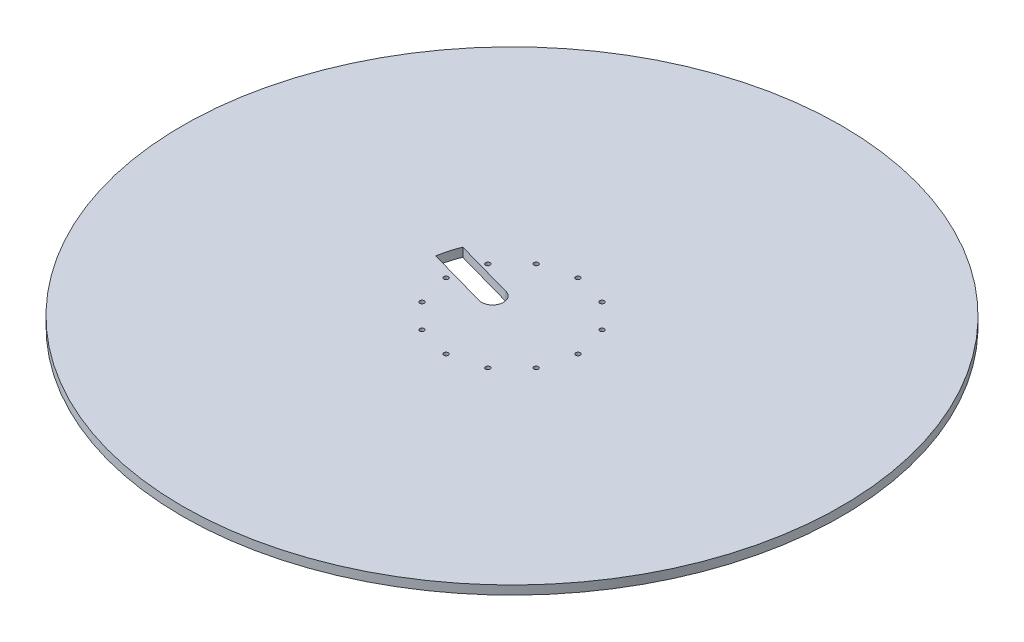
ISO-10303-21;
HEADER;
FILE_DESCRIPTION(('STEP AP214'),'2;1');
FILE_NAME('part.step','',(''),(''),'','','');
FILE_SCHEMA(('AUTOMOTIVE_DESIGN { 1 0 10303 214 1 1 1 1 }'));
ENDSEC;
DATA;
#1=APPLICATION_CONTEXT('core data for automotive mechanical design processes');
#2=APPLICATION_PROTOCOL_DEFINITION('international standard','automotive_design',2000,#1);
#3=PRODUCT_CONTEXT('',#1,'mechanical');
#4=PRODUCT('Part','Part','',(#3));
#5=PRODUCT_RELATED_PRODUCT_CATEGORY('part','',(#4));
#6=PRODUCT_DEFINITION_FORMATION('','',#4);
#7=PRODUCT_DEFINITION_CONTEXT('part definition',#1,'design');
#8=PRODUCT_DEFINITION('design','',#6,#7);
#9=PRODUCT_DEFINITION_SHAPE('','',#8);
#10=(LENGTH_UNIT() NAMED_UNIT(*) SI_UNIT(.MILLI.,.METRE.));
#11=(NAMED_UNIT(*) PLANE_ANGLE_UNIT() SI_UNIT($,.RADIAN.));
#12=(NAMED_UNIT(*) SI_UNIT($,.STERADIAN.) SOLID_ANGLE_UNIT());
#13=UNCERTAINTY_MEASURE_WITH_UNIT(LENGTH_MEASURE(1.E-05),#10,'distance_accuracy_value','');
#14=(GEOMETRIC_REPRESENTATION_CONTEXT(3) GLOBAL_UNCERTAINTY_ASSIGNED_CONTEXT((#13)) GLOBAL_UNIT_ASSIGNED_CONTEXT((#10,
#11,#12)) REPRESENTATION_CONTEXT('',''));
#15=CARTESIAN_POINT('',(0.,0.,0.));
#16=DIRECTION('',(0.,0.,1.));
#17=DIRECTION('',(1.,0.,0.));
#18=AXIS2_PLACEMENT_3D('',#15,#16,#17);
#19=CARTESIAN_POINT('',(0.,8.,0.));
#20=DIRECTION('',(0.,1.,0.));
#21=DIRECTION('',(0.,0.,1.));
#22=AXIS2_PLACEMENT_3D('',#19,#20,#21);
#23=PLANE('',#22);
#24=CARTESIAN_POINT('',(-51.961524227066,8.,-30.0000000000006));
#25=DIRECTION('',(0.,1.,0.));
#26=DIRECTION('',(0.,0.,1.));
#27=AXIS2_PLACEMENT_3D('',#24,#25,#26);
#28=CIRCLE('',#27,2.05);
#29=CARTESIAN_POINT('',(-51.961524227066,8.,-27.9500000000006));
#30=VERTEX_POINT('',#29);
#31=EDGE_CURVE('E118',#30,#30,#28,.T.);
#32=ORIENTED_EDGE('',*,*,#31,.F.);
#33=EDGE_LOOP('',(#32));
#34=FACE_BOUND('',#33,.T.);
#35=CARTESIAN_POINT('',(-51.9615242270666,8.,29.9999999999995));
#36=DIRECTION('',(0.,1.,0.));
#37=DIRECTION('',(0.,0.,1.));
#38=AXIS2_PLACEMENT_3D('',#35,#36,#37);
#39=CIRCLE('',#38,2.04999999999999);
#40=CARTESIAN_POINT('',(-51.9615242270666,8.,32.0499999999995));
#41=VERTEX_POINT('',#40);
#42=EDGE_CURVE('E130',#41,#41,#39,.T.);
#43=ORIENTED_EDGE('',*,*,#42,.F.);
#44=EDGE_LOOP('',(#43));
#45=FACE_BOUND('',#44,.T.);
#46=CARTESIAN_POINT('',(-4.18977760661176E-13,8.,60.));
#47=DIRECTION('',(0.,1.,0.));
#48=DIRECTION('',(0.,0.,1.));
#49=AXIS2_PLACEMENT_3D('',#46,#47,#48);
#50=CIRCLE('',#49,2.05);
#51=CARTESIAN_POINT('',(-4.18977760661176E-13,8.,62.05));
#52=VERTEX_POINT('',#51);
#53=EDGE_CURVE('E142',#52,#52,#50,.T.);
#54=ORIENTED_EDGE('',*,*,#53,.F.);
#55=EDGE_LOOP('',(#54));
#56=FACE_BOUND('',#55,.T.);
#57=CARTESIAN_POINT('',(51.9615242270662,8.,30.0000000000002));
#58=DIRECTION('',(0.,1.,0.));
#59=DIRECTION('',(0.,0.,1.));
#60=AXIS2_PLACEMENT_3D('',#57,#58,#59);
#61=CIRCLE('',#60,2.05);
#62=CARTESIAN_POINT('',(51.9615242270662,8.,32.0500000000002));
#63=VERTEX_POINT('',#62);
#64=EDGE_CURVE('E154',#63,#63,#61,.T.);
#65=ORIENTED_EDGE('',*,*,#64,.F.);
#66=EDGE_LOOP('',(#65));
#67=FACE_BOUND('',#66,.T.);
#68=CARTESIAN_POINT('',(51.9615242270664,8.,-29.9999999999999));
#69=DIRECTION('',(0.,1.,0.));
#70=DIRECTION('',(0.,0.,1.));
#71=AXIS2_PLACEMENT_3D('',#68,#69,#70);
#72=CIRCLE('',#71,2.04999999999999);
#73=CARTESIAN_POINT('',(51.9615242270664,8.,-27.9499999999999));
#74=VERTEX_POINT('',#73);
#75=EDGE_CURVE('E166',#74,#74,#72,.T.);
#76=ORIENTED_EDGE('',*,*,#75,.F.);
#77=EDGE_LOOP('',(#76));
#78=FACE_BOUND('',#77,.T.);
#79=CARTESIAN_POINT('',(0.,8.,-60.));
#80=DIRECTION('',(0.,1.,0.));
#81=DIRECTION('',(0.,0.,1.));
#82=AXIS2_PLACEMENT_3D('',#79,#80,#81);
#83=CIRCLE('',#82,2.05);
#84=CARTESIAN_POINT('',(0.,8.,-57.95));
#85=VERTEX_POINT('',#84);
#86=EDGE_CURVE('E178',#85,#85,#83,.T.);
#87=ORIENTED_EDGE('',*,*,#86,.F.);
#88=EDGE_LOOP('',(#87));
#89=FACE_BOUND('',#88,.T.);
#90=CARTESIAN_POINT('',(0.,8.,0.));
#91=DIRECTION('',(0.,1.,0.));
#92=DIRECTION('',(0.,0.,1.));
#93=AXIS2_PLACEMENT_3D('',#90,#91,#92);
#94=CIRCLE('',#93,300.);
#95=CARTESIAN_POINT('',(0.,8.,300.));
#96=VERTEX_POINT('',#95);
#97=EDGE_CURVE('E184',#96,#96,#94,.T.);
#98=ORIENTED_EDGE('',*,*,#97,.T.);
#99=EDGE_LOOP('',(#98));
#100=FACE_BOUND('',#99,.T.);
#101=CARTESIAN_POINT('',(30.0000000000001,8.,-51.9615242270663));
#102=DIRECTION('',(0.,1.,0.));
#103=DIRECTION('',(0.,0.,1.));
#104=AXIS2_PLACEMENT_3D('',#101,#102,#103);
#105=CIRCLE('',#104,2.05);
#106=CARTESIAN_POINT('',(30.0000000000001,8.,-49.9115242270663));
#107=VERTEX_POINT('',#106);
#108=EDGE_CURVE('E172',#107,#107,#105,.T.);
#109=ORIENTED_EDGE('',*,*,#108,.F.);
#110=EDGE_LOOP('',(#109));
#111=FACE_BOUND('',#110,.T.);
#112=CARTESIAN_POINT('',(60.,8.,2.09488880330588E-13));
#113=DIRECTION('',(0.,1.,0.));
#114=DIRECTION('',(0.,0.,1.));
#115=AXIS2_PLACEMENT_3D('',#112,#113,#114);
#116=CIRCLE('',#115,2.04999999999999);
#117=CARTESIAN_POINT('',(60.,8.,2.0500000000002));
#118=VERTEX_POINT('',#117);
#119=EDGE_CURVE('E160',#118,#118,#116,.T.);
#120=ORIENTED_EDGE('',*,*,#119,.F.);
#121=EDGE_LOOP('',(#120));
#122=FACE_BOUND('',#121,.T.);
#123=CARTESIAN_POINT('',(29.9999999999997,8.,51.9615242270665));
#124=DIRECTION('',(0.,1.,0.));
#125=DIRECTION('',(0.,0.,1.));
#126=AXIS2_PLACEMENT_3D('',#123,#124,#125);
#127=CIRCLE('',#126,2.05);
#128=CARTESIAN_POINT('',(29.9999999999997,8.,54.0115242270665));
#129=VERTEX_POINT('',#128);
#130=EDGE_CURVE('E148',#129,#129,#127,.T.);
#131=ORIENTED_EDGE('',*,*,#130,.F.);
#132=EDGE_LOOP('',(#131));
#133=FACE_BOUND('',#132,.T.);
#134=CARTESIAN_POINT('',(-30.0000000000004,8.,51.9615242270661));
#135=DIRECTION('',(0.,1.,0.));
#136=DIRECTION('',(0.,0.,1.));
#137=AXIS2_PLACEMENT_3D('',#134,#135,#136);
#138=CIRCLE('',#137,2.05);
#139=CARTESIAN_POINT('',(-30.0000000000004,8.,54.0115242270661));
#140=VERTEX_POINT('',#139);
#141=EDGE_CURVE('E136',#140,#140,#138,.T.);
#142=ORIENTED_EDGE('',*,*,#141,.F.);
#143=EDGE_LOOP('',(#142));
#144=FACE_BOUND('',#143,.T.);
#145=CARTESIAN_POINT('',(-60.,8.,-6.28466640991764E-13));
#146=DIRECTION('',(0.,1.,0.));
#147=DIRECTION('',(0.,0.,1.));
#148=AXIS2_PLACEMENT_3D('',#145,#146,#147);
#149=CIRCLE('',#148,2.05);
#150=CARTESIAN_POINT('',(-60.,8.,2.04999999999937));
#151=VERTEX_POINT('',#150);
#152=EDGE_CURVE('E124',#151,#151,#149,.T.);
#153=ORIENTED_EDGE('',*,*,#152,.F.);
#154=EDGE_LOOP('',(#153));
#155=FACE_BOUND('',#154,.T.);
#156=CARTESIAN_POINT('',(-29.9999999999993,8.,-51.9615242270667));
#157=DIRECTION('',(0.,1.,0.));
#158=DIRECTION('',(0.,0.,1.));
#159=AXIS2_PLACEMENT_3D('',#156,#157,#158);
#160=CIRCLE('',#159,2.05);
#161=CARTESIAN_POINT('',(-29.9999999999993,8.,-49.9115242270667));
#162=VERTEX_POINT('',#161);
#163=EDGE_CURVE('E112',#162,#162,#160,.T.);
#164=ORIENTED_EDGE('',*,*,#163,.F.);
#165=EDGE_LOOP('',(#164));
#166=FACE_BOUND('',#165,.T.);
#167=DIRECTION('',(-0.962954412182271,0.,-0.26966423577979));
#168=VECTOR('',#167,1.);
#169=CARTESIAN_POINT('',(2.6966423577979,8.,-9.62954412182271));
#170=LINE('',#169,#168);
#171=CARTESIAN_POINT('',(-21.85869515285,8.,-16.5059821342074));
#172=VERTEX_POINT('',#171);
#173=CARTESIAN_POINT('',(-76.6463602725632,8.,-31.8486335180716));
#174=VERTEX_POINT('',#173);
#175=EDGE_CURVE('E102',#172,#174,#170,.T.);
#176=ORIENTED_EDGE('',*,*,#175,.F.);
#177=CARTESIAN_POINT('',(-24.5553375106479,8.,-6.87643801238465));
#178=DIRECTION('',(0.,1.,0.));
#179=DIRECTION('',(0.,0.,1.));
#180=AXIS2_PLACEMENT_3D('',#177,#178,#179);
#181=CIRCLE('',#180,10.);
#182=CARTESIAN_POINT('',(-14.9257933888252,8.,-4.17979565458674));
#183=VERTEX_POINT('',#182);
#184=EDGE_CURVE('E41',#172,#183,#181,.F.);
#185=ORIENTED_EDGE('',*,*,#184,.T.);
#186=CARTESIAN_POINT('',(-24.5553375106479,8.,-6.87643801238464));
#187=DIRECTION('',(0.,1.,0.));
#188=DIRECTION('',(0.,0.,1.));
#189=AXIS2_PLACEMENT_3D('',#186,#187,#188);
#190=CIRCLE('',#189,10.);
#191=CARTESIAN_POINT('',(-27.2519798684458,8.,2.75310610943807));
#192=VERTEX_POINT('',#191);
#193=EDGE_CURVE('E192',#183,#192,#190,.F.);
#194=ORIENTED_EDGE('',*,*,#193,.T.);
#195=DIRECTION('',(-0.96295441218227,0.,-0.26966423577979));
#196=VECTOR('',#195,1.);
#197=CARTESIAN_POINT('',(-2.6966423577979,8.,9.62954412182271));
#198=LINE('',#197,#196);
#199=CARTESIAN_POINT('',(-82.0396449881591,8.,-12.5895452744262));
#200=VERTEX_POINT('',#199);
#201=EDGE_CURVE('E104',#192,#200,#198,.T.);
#202=ORIENTED_EDGE('',*,*,#201,.T.);
#203=CARTESIAN_POINT('',(0.,8.,0.));
#204=DIRECTION('',(0.,1.,0.));
#205=DIRECTION('',(0.,0.,1.));
#206=AXIS2_PLACEMENT_3D('',#203,#204,#205);
#207=CIRCLE('',#206,83.);
#208=EDGE_CURVE('E97',#200,#174,#207,.F.);
#209=ORIENTED_EDGE('',*,*,#208,.T.);
#210=EDGE_LOOP('',(#176,#185,#194,#202,#209));
#211=FACE_BOUND('',#210,.T.);
#212=ADVANCED_FACE('F32',(#34,#45,#56,#67,#78,#89,#100,#111,#122,#133,#144,#155,#166,#211),#23,.T.);
#213=CARTESIAN_POINT('',(0.,0.,0.));
#214=DIRECTION('',(0.,1.,0.));
#215=DIRECTION('',(0.,0.,1.));
#216=AXIS2_PLACEMENT_3D('',#213,#214,#215);
#217=PLANE('',#216);
#218=CARTESIAN_POINT('',(-29.9999999999993,0.,-51.9615242270667));
#219=DIRECTION('',(0.,1.,0.));
#220=DIRECTION('',(0.,0.,1.));
#221=AXIS2_PLACEMENT_3D('',#218,#219,#220);
#222=CIRCLE('',#221,2.05);
#223=CARTESIAN_POINT('',(-29.9999999999993,0.,-49.9115242270667));
#224=VERTEX_POINT('',#223);
#225=EDGE_CURVE('E110',#224,#224,#222,.T.);
#226=ORIENTED_EDGE('',*,*,#225,.T.);
#227=EDGE_LOOP('',(#226));
#228=FACE_BOUND('',#227,.T.);
#229=CARTESIAN_POINT('',(-51.961524227066,0.,-30.0000000000006));
#230=DIRECTION('',(0.,1.,0.));
#231=DIRECTION('',(0.,0.,1.));
#232=AXIS2_PLACEMENT_3D('',#229,#230,#231);
#233=CIRCLE('',#232,2.05);
#234=CARTESIAN_POINT('',(-51.961524227066,0.,-27.9500000000006));
#235=VERTEX_POINT('',#234);
#236=EDGE_CURVE('E115',#235,#235,#233,.T.);
#237=ORIENTED_EDGE('',*,*,#236,.T.);
#238=EDGE_LOOP('',(#237));
#239=FACE_BOUND('',#238,.T.);
#240=CARTESIAN_POINT('',(-60.,0.,-6.28466640991764E-13));
#241=DIRECTION('',(0.,1.,0.));
#242=DIRECTION('',(0.,0.,1.));
#243=AXIS2_PLACEMENT_3D('',#240,#241,#242);
#244=CIRCLE('',#243,2.05);
#245=CARTESIAN_POINT('',(-60.,0.,2.04999999999937));
#246=VERTEX_POINT('',#245);
#247=EDGE_CURVE('E121',#246,#246,#244,.T.);
#248=ORIENTED_EDGE('',*,*,#247,.T.);
#249=EDGE_LOOP('',(#248));
#250=FACE_BOUND('',#249,.T.);
#251=CARTESIAN_POINT('',(-51.9615242270666,0.,29.9999999999995));
#252=DIRECTION('',(0.,1.,0.));
#253=DIRECTION('',(0.,0.,1.));
#254=AXIS2_PLACEMENT_3D('',#251,#252,#253);
#255=CIRCLE('',#254,2.04999999999999);
#256=CARTESIAN_POINT('',(-51.9615242270666,0.,32.0499999999995));
#257=VERTEX_POINT('',#256);
#258=EDGE_CURVE('E127',#257,#257,#255,.T.);
#259=ORIENTED_EDGE('',*,*,#258,.T.);
#260=EDGE_LOOP('',(#259));
#261=FACE_BOUND('',#260,.T.);
#262=CARTESIAN_POINT('',(-30.0000000000004,0.,51.9615242270661));
#263=DIRECTION('',(0.,1.,0.));
#264=DIRECTION('',(0.,0.,1.));
#265=AXIS2_PLACEMENT_3D('',#262,#263,#264);
#266=CIRCLE('',#265,2.05);
#267=CARTESIAN_POINT('',(-30.0000000000004,0.,54.0115242270661));
#268=VERTEX_POINT('',#267);
#269=EDGE_CURVE('E133',#268,#268,#266,.T.);
#270=ORIENTED_EDGE('',*,*,#269,.T.);
#271=EDGE_LOOP('',(#270));
#272=FACE_BOUND('',#271,.T.);
#273=CARTESIAN_POINT('',(-4.18977760661176E-13,0.,60.));
#274=DIRECTION('',(0.,1.,0.));
#275=DIRECTION('',(0.,0.,1.));
#276=AXIS2_PLACEMENT_3D('',#273,#274,#275);
#277=CIRCLE('',#276,2.05);
#278=CARTESIAN_POINT('',(-4.18977760661176E-13,0.,62.05));
#279=VERTEX_POINT('',#278);
#280=EDGE_CURVE('E139',#279,#279,#277,.T.);
#281=ORIENTED_EDGE('',*,*,#280,.T.);
#282=EDGE_LOOP('',(#281));
#283=FACE_BOUND('',#282,.T.);
#284=CARTESIAN_POINT('',(29.9999999999997,0.,51.9615242270665));
#285=DIRECTION('',(0.,1.,0.));
#286=DIRECTION('',(0.,0.,1.));
#287=AXIS2_PLACEMENT_3D('',#284,#285,#286);
#288=CIRCLE('',#287,2.05);
#289=CARTESIAN_POINT('',(29.9999999999997,0.,54.0115242270665));
#290=VERTEX_POINT('',#289);
#291=EDGE_CURVE('E145',#290,#290,#288,.T.);
#292=ORIENTED_EDGE('',*,*,#291,.T.);
#293=EDGE_LOOP('',(#292));
#294=FACE_BOUND('',#293,.T.);
#295=CARTESIAN_POINT('',(51.9615242270662,0.,30.0000000000002));
#296=DIRECTION('',(0.,1.,0.));
#297=DIRECTION('',(0.,0.,1.));
#298=AXIS2_PLACEMENT_3D('',#295,#296,#297);
#299=CIRCLE('',#298,2.05);
#300=CARTESIAN_POINT('',(51.9615242270662,0.,32.0500000000002));
#301=VERTEX_POINT('',#300);
#302=EDGE_CURVE('E151',#301,#301,#299,.T.);
#303=ORIENTED_EDGE('',*,*,#302,.T.);
#304=EDGE_LOOP('',(#303));
#305=FACE_BOUND('',#304,.T.);
#306=CARTESIAN_POINT('',(60.,0.,2.09488880330588E-13));
#307=DIRECTION('',(0.,1.,0.));
#308=DIRECTION('',(0.,0.,1.));
#309=AXIS2_PLACEMENT_3D('',#306,#307,#308);
#310=CIRCLE('',#309,2.04999999999999);
#311=CARTESIAN_POINT('',(60.,0.,2.0500000000002));
#312=VERTEX_POINT('',#311);
#313=EDGE_CURVE('E157',#312,#312,#310,.T.);
#314=ORIENTED_EDGE('',*,*,#313,.T.);
#315=EDGE_LOOP('',(#314));
#316=FACE_BOUND('',#315,.T.);
#317=CARTESIAN_POINT('',(51.9615242270664,0.,-29.9999999999999));
#318=DIRECTION('',(0.,1.,0.));
#319=DIRECTION('',(0.,0.,1.));
#320=AXIS2_PLACEMENT_3D('',#317,#318,#319);
#321=CIRCLE('',#320,2.04999999999999);
#322=CARTESIAN_POINT('',(51.9615242270664,0.,-27.9499999999999));
#323=VERTEX_POINT('',#322);
#324=EDGE_CURVE('E163',#323,#323,#321,.T.);
#325=ORIENTED_EDGE('',*,*,#324,.T.);
#326=EDGE_LOOP('',(#325));
#327=FACE_BOUND('',#326,.T.);
#328=CARTESIAN_POINT('',(30.0000000000001,0.,-51.9615242270663));
#329=DIRECTION('',(0.,1.,0.));
#330=DIRECTION('',(0.,0.,1.));
#331=AXIS2_PLACEMENT_3D('',#328,#329,#330);
#332=CIRCLE('',#331,2.05);
#333=CARTESIAN_POINT('',(30.0000000000001,0.,-49.9115242270663));
#334=VERTEX_POINT('',#333);
#335=EDGE_CURVE('E169',#334,#334,#332,.T.);
#336=ORIENTED_EDGE('',*,*,#335,.T.);
#337=EDGE_LOOP('',(#336));
#338=FACE_BOUND('',#337,.T.);
#339=CARTESIAN_POINT('',(0.,0.,-60.));
#340=DIRECTION('',(0.,1.,0.));
#341=DIRECTION('',(0.,0.,1.));
#342=AXIS2_PLACEMENT_3D('',#339,#340,#341);
#343=CIRCLE('',#342,2.05);
#344=CARTESIAN_POINT('',(0.,0.,-57.95));
#345=VERTEX_POINT('',#344);
#346=EDGE_CURVE('E175',#345,#345,#343,.T.);
#347=ORIENTED_EDGE('',*,*,#346,.T.);
#348=EDGE_LOOP('',(#347));
#349=FACE_BOUND('',#348,.T.);
#350=CARTESIAN_POINT('',(0.,0.,0.));
#351=DIRECTION('',(0.,1.,0.));
#352=DIRECTION('',(0.,0.,1.));
#353=AXIS2_PLACEMENT_3D('',#350,#351,#352);
#354=CIRCLE('',#353,300.);
#355=CARTESIAN_POINT('',(0.,0.,300.));
#356=VERTEX_POINT('',#355);
#357=EDGE_CURVE('E181',#356,#356,#354,.T.);
#358=ORIENTED_EDGE('',*,*,#357,.F.);
#359=EDGE_LOOP('',(#358));
#360=FACE_BOUND('',#359,.T.);
#361=CARTESIAN_POINT('',(0.,0.,0.));
#362=DIRECTION('',(0.,1.,0.));
#363=DIRECTION('',(0.,0.,1.));
#364=AXIS2_PLACEMENT_3D('',#361,#362,#363);
#365=CIRCLE('',#364,83.);
#366=CARTESIAN_POINT('',(-82.0396449881591,0.,-12.5895452744262));
#367=VERTEX_POINT('',#366);
#368=CARTESIAN_POINT('',(-76.6463602725632,0.,-31.8486335180716));
#369=VERTEX_POINT('',#368);
#370=EDGE_CURVE('E88',#367,#369,#365,.F.);
#371=ORIENTED_EDGE('',*,*,#370,.F.);
#372=DIRECTION('',(-0.96295441218227,0.,-0.26966423577979));
#373=VECTOR('',#372,1.);
#374=CARTESIAN_POINT('',(-2.6966423577979,0.,9.62954412182271));
#375=LINE('',#374,#373);
#376=CARTESIAN_POINT('',(-27.2519798684458,0.,2.75310610943807));
#377=VERTEX_POINT('',#376);
#378=EDGE_CURVE('E79',#377,#367,#375,.T.);
#379=ORIENTED_EDGE('',*,*,#378,.F.);
#380=CARTESIAN_POINT('',(-24.5553375106479,0.,-6.87643801238464));
#381=DIRECTION('',(0.,1.,0.));
#382=DIRECTION('',(0.,0.,1.));
#383=AXIS2_PLACEMENT_3D('',#380,#381,#382);
#384=CIRCLE('',#383,10.);
#385=CARTESIAN_POINT('',(-14.9257933888252,0.,-4.17979565458674));
#386=VERTEX_POINT('',#385);
#387=EDGE_CURVE('E47',#377,#386,#384,.T.);
#388=ORIENTED_EDGE('',*,*,#387,.T.);
#389=CARTESIAN_POINT('',(-24.5553375106479,0.,-6.87643801238465));
#390=DIRECTION('',(0.,1.,0.));
#391=DIRECTION('',(0.,0.,1.));
#392=AXIS2_PLACEMENT_3D('',#389,#390,#391);
#393=CIRCLE('',#392,10.);
#394=CARTESIAN_POINT('',(-21.85869515285,0.,-16.5059821342074));
#395=VERTEX_POINT('',#394);
#396=EDGE_CURVE('E11',#386,#395,#393,.T.);
#397=ORIENTED_EDGE('',*,*,#396,.T.);
#398=DIRECTION('',(-0.962954412182271,0.,-0.26966423577979));
#399=VECTOR('',#398,1.);
#400=CARTESIAN_POINT('',(2.6966423577979,0.,-9.62954412182271));
#401=LINE('',#400,#399);
#402=EDGE_CURVE('E87',#395,#369,#401,.T.);
#403=ORIENTED_EDGE('',*,*,#402,.T.);
#404=EDGE_LOOP('',(#371,#379,#388,#397,#403));
#405=FACE_BOUND('',#404,.T.);
#406=ADVANCED_FACE('F100',(#228,#239,#250,#261,#272,#283,#294,#305,#316,#327,#338,#349,#360,
#405),#217,.F.);
#407=CARTESIAN_POINT('',(0.,8.,0.));
#408=DIRECTION('',(0.,-1.,0.));
#409=DIRECTION('',(0.,0.,-1.));
#410=AXIS2_PLACEMENT_3D('',#407,#408,#409);
#411=CYLINDRICAL_SURFACE('',#410,300.);
#412=ORIENTED_EDGE('',*,*,#97,.F.);
#413=EDGE_LOOP('',(#412));
#414=FACE_BOUND('',#413,.T.);
#415=ORIENTED_EDGE('',*,*,#357,.T.);
#416=EDGE_LOOP('',(#415));
#417=FACE_BOUND('',#416,.T.);
#418=ADVANCED_FACE('F218',(#414,#417),#411,.T.);
#419=CARTESIAN_POINT('',(0.,8.,-60.));
#420=DIRECTION('',(0.,-1.,0.));
#421=DIRECTION('',(0.,0.,-1.));
#422=AXIS2_PLACEMENT_3D('',#419,#420,#421);
#423=CYLINDRICAL_SURFACE('',#422,2.05);
#424=ORIENTED_EDGE('',*,*,#86,.T.);
#425=EDGE_LOOP('',(#424));
#426=FACE_BOUND('',#425,.T.);
#427=ORIENTED_EDGE('',*,*,#346,.F.);
#428=EDGE_LOOP('',(#427));
#429=FACE_BOUND('',#428,.T.);
#430=ADVANCED_FACE('F224',(#426,#429),#423,.F.);
#431=CARTESIAN_POINT('',(30.0000000000001,8.,-51.9615242270663));
#432=DIRECTION('',(0.,-1.,0.));
#433=DIRECTION('',(0.,0.,-1.));
#434=AXIS2_PLACEMENT_3D('',#431,#432,#433);
#435=CYLINDRICAL_SURFACE('',#434,2.05);
#436=ORIENTED_EDGE('',*,*,#108,.T.);
#437=EDGE_LOOP('',(#436));
#438=FACE_BOUND('',#437,.T.);
#439=ORIENTED_EDGE('',*,*,#335,.F.);
#440=EDGE_LOOP('',(#439));
#441=FACE_BOUND('',#440,.T.);
#442=ADVANCED_FACE('F358',(#438,#441),#435,.F.);
#443=CARTESIAN_POINT('',(51.9615242270664,8.,-29.9999999999999));
#444=DIRECTION('',(0.,-1.,0.));
#445=DIRECTION('',(0.,0.,-1.));
#446=AXIS2_PLACEMENT_3D('',#443,#444,#445);
#447=CYLINDRICAL_SURFACE('',#446,2.04999999999999);
#448=ORIENTED_EDGE('',*,*,#75,.T.);
#449=EDGE_LOOP('',(#448));
#450=FACE_BOUND('',#449,.T.);
#451=ORIENTED_EDGE('',*,*,#324,.F.);
#452=EDGE_LOOP('',(#451));
#453=FACE_BOUND('',#452,.T.);
#454=ADVANCED_FACE('F348',(#450,#453),#447,.F.);
#455=CARTESIAN_POINT('',(60.,8.,2.09488880330588E-13));
#456=DIRECTION('',(0.,-1.,0.));
#457=DIRECTION('',(0.,0.,-1.));
#458=AXIS2_PLACEMENT_3D('',#455,#456,#457);
#459=CYLINDRICAL_SURFACE('',#458,2.04999999999999);
#460=ORIENTED_EDGE('',*,*,#119,.T.);
#461=EDGE_LOOP('',(#460));
#462=FACE_BOUND('',#461,.T.);
#463=ORIENTED_EDGE('',*,*,#313,.F.);
#464=EDGE_LOOP('',(#463));
#465=FACE_BOUND('',#464,.T.);
#466=ADVANCED_FACE('F338',(#462,#465),#459,.F.);
#467=CARTESIAN_POINT('',(51.9615242270662,8.,30.0000000000002));
#468=DIRECTION('',(0.,-1.,0.));
#469=DIRECTION('',(0.,0.,-1.));
#470=AXIS2_PLACEMENT_3D('',#467,#468,#469);
#471=CYLINDRICAL_SURFACE('',#470,2.05);
#472=ORIENTED_EDGE('',*,*,#64,.T.);
#473=EDGE_LOOP('',(#472));
#474=FACE_BOUND('',#473,.T.);
#475=ORIENTED_EDGE('',*,*,#302,.F.);
#476=EDGE_LOOP('',(#475));
#477=FACE_BOUND('',#476,.T.);
#478=ADVANCED_FACE('F328',(#474,#477),#471,.F.);
#479=CARTESIAN_POINT('',(29.9999999999997,8.,51.9615242270665));
#480=DIRECTION('',(0.,-1.,0.));
#481=DIRECTION('',(0.,0.,-1.));
#482=AXIS2_PLACEMENT_3D('',#479,#480,#481);
#483=CYLINDRICAL_SURFACE('',#482,2.05);
#484=ORIENTED_EDGE('',*,*,#130,.T.);
#485=EDGE_LOOP('',(#484));
#486=FACE_BOUND('',#485,.T.);
#487=ORIENTED_EDGE('',*,*,#291,.F.);
#488=EDGE_LOOP('',(#487));
#489=FACE_BOUND('',#488,.T.);
#490=ADVANCED_FACE('F318',(#486,#489),#483,.F.);
#491=CARTESIAN_POINT('',(-4.18977760661176E-13,8.,60.));
#492=DIRECTION('',(0.,-1.,0.));
#493=DIRECTION('',(0.,0.,-1.));
#494=AXIS2_PLACEMENT_3D('',#491,#492,#493);
#495=CYLINDRICAL_SURFACE('',#494,2.05);
#496=ORIENTED_EDGE('',*,*,#53,.T.);
#497=EDGE_LOOP('',(#496));
#498=FACE_BOUND('',#497,.T.);
#499=ORIENTED_EDGE('',*,*,#280,.F.);
#500=EDGE_LOOP('',(#499));
#501=FACE_BOUND('',#500,.T.);
#502=ADVANCED_FACE('F308',(#498,#501),#495,.F.);
#503=CARTESIAN_POINT('',(-30.0000000000004,8.,51.9615242270661));
#504=DIRECTION('',(0.,-1.,0.));
#505=DIRECTION('',(0.,0.,-1.));
#506=AXIS2_PLACEMENT_3D('',#503,#504,#505);
#507=CYLINDRICAL_SURFACE('',#506,2.05);
#508=ORIENTED_EDGE('',*,*,#141,.T.);
#509=EDGE_LOOP('',(#508));
#510=FACE_BOUND('',#509,.T.);
#511=ORIENTED_EDGE('',*,*,#269,.F.);
#512=EDGE_LOOP('',(#511));
#513=FACE_BOUND('',#512,.T.);
#514=ADVANCED_FACE('F298',(#510,#513),#507,.F.);
#515=CARTESIAN_POINT('',(-51.9615242270666,8.,29.9999999999995));
#516=DIRECTION('',(0.,-1.,0.));
#517=DIRECTION('',(0.,0.,-1.));
#518=AXIS2_PLACEMENT_3D('',#515,#516,#517);
#519=CYLINDRICAL_SURFACE('',#518,2.04999999999999);
#520=ORIENTED_EDGE('',*,*,#42,.T.);
#521=EDGE_LOOP('',(#520));
#522=FACE_BOUND('',#521,.T.);
#523=ORIENTED_EDGE('',*,*,#258,.F.);
#524=EDGE_LOOP('',(#523));
#525=FACE_BOUND('',#524,.T.);
#526=ADVANCED_FACE('F288',(#522,#525),#519,.F.);
#527=CARTESIAN_POINT('',(-60.,8.,-6.28466640991764E-13));
#528=DIRECTION('',(0.,-1.,0.));
#529=DIRECTION('',(0.,0.,-1.));
#530=AXIS2_PLACEMENT_3D('',#527,#528,#529);
#531=CYLINDRICAL_SURFACE('',#530,2.05);
#532=ORIENTED_EDGE('',*,*,#152,.T.);
#533=EDGE_LOOP('',(#532));
#534=FACE_BOUND('',#533,.T.);
#535=ORIENTED_EDGE('',*,*,#247,.F.);
#536=EDGE_LOOP('',(#535));
#537=FACE_BOUND('',#536,.T.);
#538=ADVANCED_FACE('F278',(#534,#537),#531,.F.);
#539=CARTESIAN_POINT('',(-51.961524227066,8.,-30.0000000000006));
#540=DIRECTION('',(0.,-1.,0.));
#541=DIRECTION('',(0.,0.,-1.));
#542=AXIS2_PLACEMENT_3D('',#539,#540,#541);
#543=CYLINDRICAL_SURFACE('',#542,2.05);
#544=ORIENTED_EDGE('',*,*,#31,.T.);
#545=EDGE_LOOP('',(#544));
#546=FACE_BOUND('',#545,.T.);
#547=ORIENTED_EDGE('',*,*,#236,.F.);
#548=EDGE_LOOP('',(#547));
#549=FACE_BOUND('',#548,.T.);
#550=ADVANCED_FACE('F268',(#546,#549),#543,.F.);
#551=CARTESIAN_POINT('',(-29.9999999999993,8.,-51.9615242270667));
#552=DIRECTION('',(0.,-1.,0.));
#553=DIRECTION('',(0.,0.,-1.));
#554=AXIS2_PLACEMENT_3D('',#551,#552,#553);
#555=CYLINDRICAL_SURFACE('',#554,2.05);
#556=ORIENTED_EDGE('',*,*,#163,.T.);
#557=EDGE_LOOP('',(#556));
#558=FACE_BOUND('',#557,.T.);
#559=ORIENTED_EDGE('',*,*,#225,.F.);
#560=EDGE_LOOP('',(#559));
#561=FACE_BOUND('',#560,.T.);
#562=ADVANCED_FACE('F210',(#558,#561),#555,.F.);
#563=CARTESIAN_POINT('',(0.,0.,0.));
#564=DIRECTION('',(0.,1.,0.));
#565=DIRECTION('',(0.,0.,1.));
#566=AXIS2_PLACEMENT_3D('',#563,#564,#565);
#567=CYLINDRICAL_SURFACE('',#566,83.);
#568=ORIENTED_EDGE('',*,*,#208,.F.);
#569=DIRECTION('',(0.,1.,0.));
#570=VECTOR('',#569,1.);
#571=CARTESIAN_POINT('',(-82.0396449881591,0.,-12.5895452744262));
#572=LINE('',#571,#570);
#573=EDGE_CURVE('E83',#367,#200,#572,.T.);
#574=ORIENTED_EDGE('',*,*,#573,.F.);
#575=ORIENTED_EDGE('',*,*,#370,.T.);
#576=DIRECTION('',(0.,1.,0.));
#577=VECTOR('',#576,1.);
#578=CARTESIAN_POINT('',(-76.6463602725632,0.,-31.8486335180716));
#579=LINE('',#578,#577);
#580=EDGE_CURVE('E98',#369,#174,#579,.T.);
#581=ORIENTED_EDGE('',*,*,#580,.T.);
#582=EDGE_LOOP('',(#568,#574,#575,#581));
#583=FACE_BOUND('',#582,.T.);
#584=ADVANCED_FACE('F93',(#583),#567,.F.);
#585=CARTESIAN_POINT('',(2.6966423577979,0.,-9.62954412182271));
#586=DIRECTION('',(0.26966423577979,0.,-0.96295441218227));
#587=DIRECTION('',(-0.962954412182271,0.,-0.26966423577979));
#588=AXIS2_PLACEMENT_3D('',#585,#586,#587);
#589=PLANE('',#588);
#590=ORIENTED_EDGE('',*,*,#402,.F.);
#591=DIRECTION('',(0.,1.,0.));
#592=VECTOR('',#591,1.);
#593=CARTESIAN_POINT('',(-21.85869515285,8.,-16.5059821342074));
#594=LINE('',#593,#592);
#595=EDGE_CURVE('E190',#395,#172,#594,.T.);
#596=ORIENTED_EDGE('',*,*,#595,.T.);
#597=ORIENTED_EDGE('',*,*,#175,.T.);
#598=ORIENTED_EDGE('',*,*,#580,.F.);
#599=EDGE_LOOP('',(#590,#596,#597,#598));
#600=FACE_BOUND('',#599,.T.);
#601=ADVANCED_FACE('F202',(#600),#589,.F.);
#602=CARTESIAN_POINT('',(-2.6966423577979,0.,9.62954412182271));
#603=DIRECTION('',(0.26966423577979,0.,-0.96295441218227));
#604=DIRECTION('',(-0.96295441218227,0.,-0.26966423577979));
#605=AXIS2_PLACEMENT_3D('',#602,#603,#604);
#606=PLANE('',#605);
#607=ORIENTED_EDGE('',*,*,#201,.F.);
#608=DIRECTION('',(0.,1.,0.));
#609=VECTOR('',#608,1.);
#610=CARTESIAN_POINT('',(-27.2519798684458,0.,2.75310610943807));
#611=LINE('',#610,#609);
#612=EDGE_CURVE('E85',#192,#377,#611,.F.);
#613=ORIENTED_EDGE('',*,*,#612,.T.);
#614=ORIENTED_EDGE('',*,*,#378,.T.);
#615=ORIENTED_EDGE('',*,*,#573,.T.);
#616=EDGE_LOOP('',(#607,#613,#614,#615));
#617=FACE_BOUND('',#616,.T.);
#618=ADVANCED_FACE('F82',(#617),#606,.T.);
#619=CARTESIAN_POINT('',(-24.5553375106479,0.,-6.87643801238465));
#620=DIRECTION('',(0.,-1.,0.));
#621=DIRECTION('',(0.,0.,-1.));
#622=AXIS2_PLACEMENT_3D('',#619,#620,#621);
#623=CYLINDRICAL_SURFACE('',#622,10.);
#624=ORIENTED_EDGE('',*,*,#595,.F.);
#625=ORIENTED_EDGE('',*,*,#396,.F.);
#626=DIRECTION('',(0.,1.,0.));
#627=VECTOR('',#626,1.);
#628=CARTESIAN_POINT('',(-14.9257933888252,0.,-4.17979565458675));
#629=LINE('',#628,#627);
#630=EDGE_CURVE('E36',#183,#386,#629,.F.);
#631=ORIENTED_EDGE('',*,*,#630,.F.);
#632=ORIENTED_EDGE('',*,*,#184,.F.);
#633=EDGE_LOOP('',(#624,#625,#631,#632));
#634=FACE_BOUND('',#633,.T.);
#635=ADVANCED_FACE('F34',(#634),#623,.F.);
#636=CARTESIAN_POINT('',(-24.5553375106479,0.,-6.87643801238464));
#637=DIRECTION('',(0.,1.,0.));
#638=DIRECTION('',(0.,0.,1.));
#639=AXIS2_PLACEMENT_3D('',#636,#637,#638);
#640=CYLINDRICAL_SURFACE('',#639,10.);
#641=ORIENTED_EDGE('',*,*,#387,.F.);
#642=ORIENTED_EDGE('',*,*,#612,.F.);
#643=ORIENTED_EDGE('',*,*,#193,.F.);
#644=ORIENTED_EDGE('',*,*,#630,.T.);
#645=EDGE_LOOP('',(#641,#642,#643,#644));
#646=FACE_BOUND('',#645,.T.);
#647=ADVANCED_FACE('F198',(#646),#640,.F.);
#648=CLOSED_SHELL('',(#212,#406,#418,#430,#442,#454,#466,#478,#490,#502,#514,#526,#538,#550,
#562,#584,#601,#618,#635,#647));
#649=MANIFOLD_SOLID_BREP('B2',#648);
#650=ADVANCED_BREP_SHAPE_REPRESENTATION('',(#18,#649),#14);
#651=SHAPE_DEFINITION_REPRESENTATION(#9,#650);
ENDSEC;
END-ISO-10303-21;
